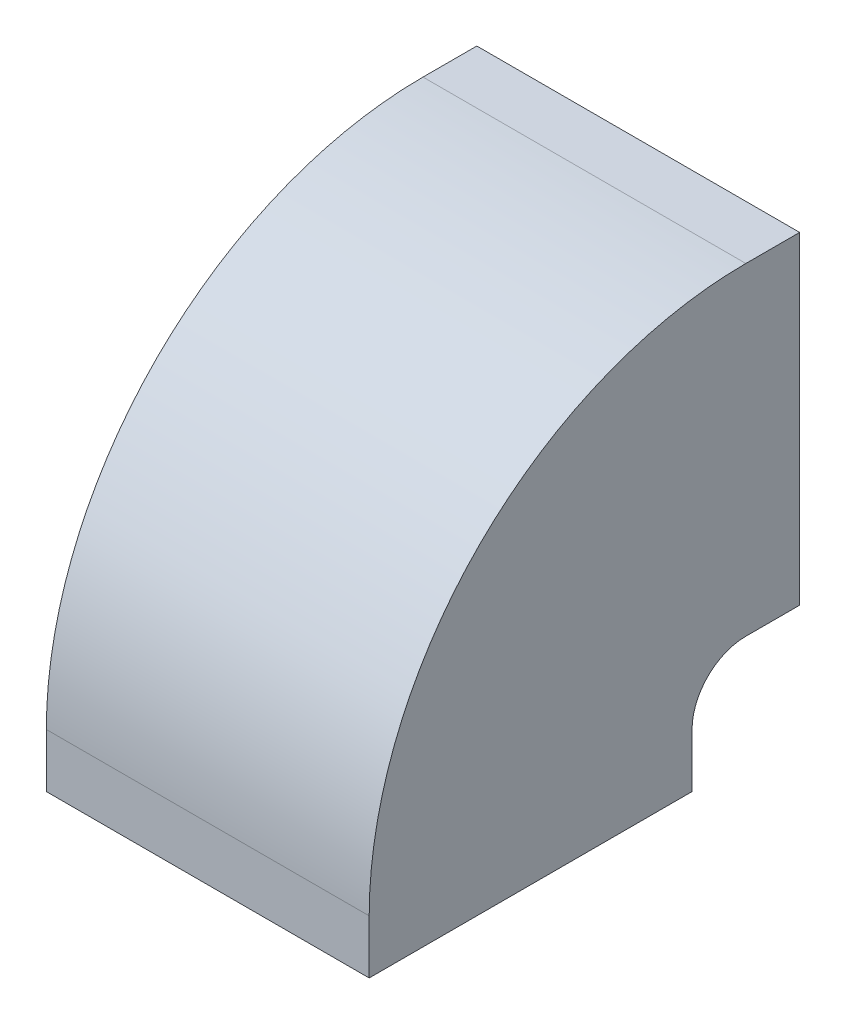
ISO-10303-21;
HEADER;
FILE_DESCRIPTION(('STEP AP214'),'2;1');
FILE_NAME('part.step','',(''),(''),'','','');
FILE_SCHEMA(('AUTOMOTIVE_DESIGN { 1 0 10303 214 1 1 1 1 }'));
ENDSEC;
DATA;
#1=APPLICATION_CONTEXT('core data for automotive mechanical design processes');
#2=APPLICATION_PROTOCOL_DEFINITION('international standard','automotive_design',2000,#1);
#3=PRODUCT_CONTEXT('',#1,'mechanical');
#4=PRODUCT('Part','Part','',(#3));
#5=PRODUCT_RELATED_PRODUCT_CATEGORY('part','',(#4));
#6=PRODUCT_DEFINITION_FORMATION('','',#4);
#7=PRODUCT_DEFINITION_CONTEXT('part definition',#1,'design');
#8=PRODUCT_DEFINITION('design','',#6,#7);
#9=PRODUCT_DEFINITION_SHAPE('','',#8);
#10=(LENGTH_UNIT() NAMED_UNIT(*) SI_UNIT(.MILLI.,.METRE.));
#11=(NAMED_UNIT(*) PLANE_ANGLE_UNIT() SI_UNIT($,.RADIAN.));
#12=(NAMED_UNIT(*) SI_UNIT($,.STERADIAN.) SOLID_ANGLE_UNIT());
#13=UNCERTAINTY_MEASURE_WITH_UNIT(LENGTH_MEASURE(1.E-05),#10,'distance_accuracy_value','');
#14=(GEOMETRIC_REPRESENTATION_CONTEXT(3) GLOBAL_UNCERTAINTY_ASSIGNED_CONTEXT((#13)) GLOBAL_UNIT_ASSIGNED_CONTEXT((#10,
#11,#12)) REPRESENTATION_CONTEXT('',''));
#15=CARTESIAN_POINT('',(0.,0.,0.));
#16=DIRECTION('',(0.,0.,1.));
#17=DIRECTION('',(1.,0.,0.));
#18=AXIS2_PLACEMENT_3D('',#15,#16,#17);
#19=CARTESIAN_POINT('',(152.4,203.2,-203.2));
#20=DIRECTION('',(0.,0.,1.));
#21=DIRECTION('',(1.,0.,0.));
#22=AXIS2_PLACEMENT_3D('',#19,#20,#21);
#23=PLANE('',#22);
#24=DIRECTION('',(0.,1.,0.));
#25=VECTOR('',#24,1.);
#26=CARTESIAN_POINT('',(0.,203.2,-203.2));
#27=LINE('',#26,#25);
#28=CARTESIAN_POINT('',(0.,50.8,-203.2));
#29=VERTEX_POINT('',#28);
#30=CARTESIAN_POINT('',(0.,203.2,-203.2));
#31=VERTEX_POINT('',#30);
#32=EDGE_CURVE('E206',#29,#31,#27,.T.);
#33=ORIENTED_EDGE('',*,*,#32,.T.);
#34=DIRECTION('',(-1.,0.,0.));
#35=VECTOR('',#34,1.);
#36=CARTESIAN_POINT('',(152.4,203.2,-203.2));
#37=LINE('',#36,#35);
#38=CARTESIAN_POINT('',(152.4,203.2,-203.2));
#39=VERTEX_POINT('',#38);
#40=EDGE_CURVE('E191',#39,#31,#37,.T.);
#41=ORIENTED_EDGE('',*,*,#40,.F.);
#42=DIRECTION('',(0.,1.,0.));
#43=VECTOR('',#42,1.);
#44=CARTESIAN_POINT('',(152.4,203.2,-203.2));
#45=LINE('',#44,#43);
#46=CARTESIAN_POINT('',(152.4,50.8,-203.2));
#47=VERTEX_POINT('',#46);
#48=EDGE_CURVE('E222',#47,#39,#45,.T.);
#49=ORIENTED_EDGE('',*,*,#48,.F.);
#50=DIRECTION('',(-1.,0.,0.));
#51=VECTOR('',#50,1.);
#52=CARTESIAN_POINT('',(152.4,50.8,-203.2));
#53=LINE('',#52,#51);
#54=EDGE_CURVE('E188',#47,#29,#53,.T.);
#55=ORIENTED_EDGE('',*,*,#54,.T.);
#56=EDGE_LOOP('',(#33,#41,#49,#55));
#57=FACE_BOUND('',#56,.T.);
#58=DIRECTION('',(0.,1.,0.));
#59=VECTOR('',#58,1.);
#60=CARTESIAN_POINT('',(2.54,25.4,-203.2));
#61=LINE('',#60,#59);
#62=CARTESIAN_POINT('',(2.54,53.34,-203.2));
#63=VERTEX_POINT('',#62);
#64=CARTESIAN_POINT('',(2.54,200.66,-203.2));
#65=VERTEX_POINT('',#64);
#66=EDGE_CURVE('E242',#63,#65,#61,.T.);
#67=ORIENTED_EDGE('',*,*,#66,.F.);
#68=DIRECTION('',(-1.,0.,0.));
#69=VECTOR('',#68,1.);
#70=CARTESIAN_POINT('',(152.4,53.34,-203.2));
#71=LINE('',#70,#69);
#72=CARTESIAN_POINT('',(149.86,53.34,-203.2));
#73=VERTEX_POINT('',#72);
#74=EDGE_CURVE('E240',#73,#63,#71,.T.);
#75=ORIENTED_EDGE('',*,*,#74,.F.);
#76=DIRECTION('',(0.,1.,0.));
#77=VECTOR('',#76,1.);
#78=CARTESIAN_POINT('',(149.86,25.4,-203.2));
#79=LINE('',#78,#77);
#80=CARTESIAN_POINT('',(149.86,200.66,-203.2));
#81=VERTEX_POINT('',#80);
#82=EDGE_CURVE('E62',#73,#81,#79,.T.);
#83=ORIENTED_EDGE('',*,*,#82,.T.);
#84=DIRECTION('',(-1.,0.,0.));
#85=VECTOR('',#84,1.);
#86=CARTESIAN_POINT('',(152.4,200.66,-203.2));
#87=LINE('',#86,#85);
#88=EDGE_CURVE('E237',#81,#65,#87,.T.);
#89=ORIENTED_EDGE('',*,*,#88,.T.);
#90=EDGE_LOOP('',(#67,#75,#83,#89));
#91=FACE_BOUND('',#90,.T.);
#92=ADVANCED_FACE('F39',(#57,#91),#23,.F.);
#93=CARTESIAN_POINT('',(152.4,0.,0.));
#94=DIRECTION('',(0.,0.,-1.));
#95=DIRECTION('',(-1.,0.,0.));
#96=AXIS2_PLACEMENT_3D('',#93,#94,#95);
#97=PLANE('',#96);
#98=DIRECTION('',(0.,-1.,0.));
#99=VECTOR('',#98,1.);
#100=CARTESIAN_POINT('',(0.,0.,0.));
#101=LINE('',#100,#99);
#102=CARTESIAN_POINT('',(0.,25.4,0.));
#103=VERTEX_POINT('',#102);
#104=CARTESIAN_POINT('',(0.,0.,0.));
#105=VERTEX_POINT('',#104);
#106=EDGE_CURVE('E216',#103,#105,#101,.T.);
#107=ORIENTED_EDGE('',*,*,#106,.T.);
#108=DIRECTION('',(-1.,0.,0.));
#109=VECTOR('',#108,1.);
#110=CARTESIAN_POINT('',(152.4,0.,0.));
#111=LINE('',#110,#109);
#112=CARTESIAN_POINT('',(152.4,0.,0.));
#113=VERTEX_POINT('',#112);
#114=EDGE_CURVE('E169',#113,#105,#111,.T.);
#115=ORIENTED_EDGE('',*,*,#114,.F.);
#116=DIRECTION('',(0.,-1.,0.));
#117=VECTOR('',#116,1.);
#118=CARTESIAN_POINT('',(152.4,0.,0.));
#119=LINE('',#118,#117);
#120=CARTESIAN_POINT('',(152.4,25.4,0.));
#121=VERTEX_POINT('',#120);
#122=EDGE_CURVE('E203',#121,#113,#119,.T.);
#123=ORIENTED_EDGE('',*,*,#122,.F.);
#124=DIRECTION('',(-1.,0.,0.));
#125=VECTOR('',#124,1.);
#126=CARTESIAN_POINT('',(152.4,25.4,0.));
#127=LINE('',#126,#125);
#128=EDGE_CURVE('E197',#121,#103,#127,.T.);
#129=ORIENTED_EDGE('',*,*,#128,.T.);
#130=EDGE_LOOP('',(#107,#115,#123,#129));
#131=FACE_BOUND('',#130,.T.);
#132=ADVANCED_FACE('F41',(#131),#97,.F.);
#133=CARTESIAN_POINT('',(152.4,0.,0.));
#134=DIRECTION('',(0.,1.,0.));
#135=DIRECTION('',(0.,0.,1.));
#136=AXIS2_PLACEMENT_3D('',#133,#134,#135);
#137=PLANE('',#136);
#138=DIRECTION('',(0.,0.,-1.));
#139=VECTOR('',#138,1.);
#140=CARTESIAN_POINT('',(149.86,0.,0.));
#141=LINE('',#140,#139);
#142=CARTESIAN_POINT('',(149.86,0.,-2.54));
#143=VERTEX_POINT('',#142);
#144=CARTESIAN_POINT('',(149.86,0.,-149.86));
#145=VERTEX_POINT('',#144);
#146=EDGE_CURVE('E47',#143,#145,#141,.T.);
#147=ORIENTED_EDGE('',*,*,#146,.T.);
#148=DIRECTION('',(-1.,0.,0.));
#149=VECTOR('',#148,1.);
#150=CARTESIAN_POINT('',(152.4,0.,-149.86));
#151=LINE('',#150,#149);
#152=CARTESIAN_POINT('',(2.54,0.,-149.86));
#153=VERTEX_POINT('',#152);
#154=EDGE_CURVE('E11',#145,#153,#151,.T.);
#155=ORIENTED_EDGE('',*,*,#154,.T.);
#156=DIRECTION('',(0.,0.,1.));
#157=VECTOR('',#156,1.);
#158=CARTESIAN_POINT('',(2.53999999999999,0.,0.));
#159=LINE('',#158,#157);
#160=CARTESIAN_POINT('',(2.53999999999999,0.,-2.54));
#161=VERTEX_POINT('',#160);
#162=EDGE_CURVE('E164',#153,#161,#159,.T.);
#163=ORIENTED_EDGE('',*,*,#162,.T.);
#164=DIRECTION('',(1.,0.,0.));
#165=VECTOR('',#164,1.);
#166=CARTESIAN_POINT('',(152.4,0.,-2.54));
#167=LINE('',#166,#165);
#168=EDGE_CURVE('E168',#161,#143,#167,.T.);
#169=ORIENTED_EDGE('',*,*,#168,.T.);
#170=EDGE_LOOP('',(#147,#155,#163,#169));
#171=FACE_BOUND('',#170,.T.);
#172=DIRECTION('',(0.,0.,-1.));
#173=VECTOR('',#172,1.);
#174=CARTESIAN_POINT('',(0.,0.,0.));
#175=LINE('',#174,#173);
#176=CARTESIAN_POINT('',(0.,0.,-152.4));
#177=VERTEX_POINT('',#176);
#178=EDGE_CURVE('E214',#105,#177,#175,.T.);
#179=ORIENTED_EDGE('',*,*,#178,.T.);
#180=DIRECTION('',(-1.,0.,0.));
#181=VECTOR('',#180,1.);
#182=CARTESIAN_POINT('',(152.4,0.,-152.4));
#183=LINE('',#182,#181);
#184=CARTESIAN_POINT('',(152.4,0.,-152.4));
#185=VERTEX_POINT('',#184);
#186=EDGE_CURVE('E179',#185,#177,#183,.T.);
#187=ORIENTED_EDGE('',*,*,#186,.F.);
#188=DIRECTION('',(0.,0.,-1.));
#189=VECTOR('',#188,1.);
#190=CARTESIAN_POINT('',(152.4,0.,0.));
#191=LINE('',#190,#189);
#192=EDGE_CURVE('E230',#113,#185,#191,.T.);
#193=ORIENTED_EDGE('',*,*,#192,.F.);
#194=ORIENTED_EDGE('',*,*,#114,.T.);
#195=EDGE_LOOP('',(#179,#187,#193,#194));
#196=FACE_BOUND('',#195,.T.);
#197=ADVANCED_FACE('F171',(#171,#196),#137,.F.);
#198=CARTESIAN_POINT('',(152.4,0.,-152.4));
#199=DIRECTION('',(0.,0.,1.));
#200=DIRECTION('',(1.,0.,0.));
#201=AXIS2_PLACEMENT_3D('',#198,#199,#200);
#202=PLANE('',#201);
#203=DIRECTION('',(0.,1.,0.));
#204=VECTOR('',#203,1.);
#205=CARTESIAN_POINT('',(0.,0.,-152.4));
#206=LINE('',#205,#204);
#207=CARTESIAN_POINT('',(0.,25.4,-152.4));
#208=VERTEX_POINT('',#207);
#209=EDGE_CURVE('E212',#177,#208,#206,.T.);
#210=ORIENTED_EDGE('',*,*,#209,.T.);
#211=DIRECTION('',(-1.,0.,0.));
#212=VECTOR('',#211,1.);
#213=CARTESIAN_POINT('',(152.4,25.4,-152.4));
#214=LINE('',#213,#212);
#215=CARTESIAN_POINT('',(152.4,25.4,-152.4));
#216=VERTEX_POINT('',#215);
#217=EDGE_CURVE('E182',#216,#208,#214,.T.);
#218=ORIENTED_EDGE('',*,*,#217,.F.);
#219=DIRECTION('',(0.,1.,0.));
#220=VECTOR('',#219,1.);
#221=CARTESIAN_POINT('',(152.4,0.,-152.4));
#222=LINE('',#221,#220);
#223=EDGE_CURVE('E228',#185,#216,#222,.T.);
#224=ORIENTED_EDGE('',*,*,#223,.F.);
#225=ORIENTED_EDGE('',*,*,#186,.T.);
#226=EDGE_LOOP('',(#210,#218,#224,#225));
#227=FACE_BOUND('',#226,.T.);
#228=ADVANCED_FACE('F320',(#227),#202,.F.);
#229=CARTESIAN_POINT('',(152.4,25.4,-177.8));
#230=DIRECTION('',(-1.,0.,0.));
#231=DIRECTION('',(0.,0.,1.));
#232=AXIS2_PLACEMENT_3D('',#229,#230,#231);
#233=CYLINDRICAL_SURFACE('',#232,25.4);
#234=CARTESIAN_POINT('',(0.,25.4,-177.8));
#235=DIRECTION('',(-1.,0.,0.));
#236=DIRECTION('',(0.,0.,-1.));
#237=AXIS2_PLACEMENT_3D('',#234,#235,#236);
#238=CIRCLE('',#237,25.4);
#239=CARTESIAN_POINT('',(0.,50.8,-177.8));
#240=VERTEX_POINT('',#239);
#241=EDGE_CURVE('E210',#208,#240,#238,.T.);
#242=ORIENTED_EDGE('',*,*,#241,.T.);
#243=DIRECTION('',(-1.,0.,0.));
#244=VECTOR('',#243,1.);
#245=CARTESIAN_POINT('',(152.4,50.8,-177.8));
#246=LINE('',#245,#244);
#247=CARTESIAN_POINT('',(152.4,50.8,-177.8));
#248=VERTEX_POINT('',#247);
#249=EDGE_CURVE('E185',#248,#240,#246,.T.);
#250=ORIENTED_EDGE('',*,*,#249,.F.);
#251=CARTESIAN_POINT('',(152.4,25.4,-177.8));
#252=DIRECTION('',(-1.,0.,0.));
#253=DIRECTION('',(0.,0.,-1.));
#254=AXIS2_PLACEMENT_3D('',#251,#252,#253);
#255=CIRCLE('',#254,25.4);
#256=EDGE_CURVE('E226',#216,#248,#255,.T.);
#257=ORIENTED_EDGE('',*,*,#256,.F.);
#258=ORIENTED_EDGE('',*,*,#217,.T.);
#259=EDGE_LOOP('',(#242,#250,#257,#258));
#260=FACE_BOUND('',#259,.T.);
#261=ADVANCED_FACE('F316',(#260),#233,.F.);
#262=CARTESIAN_POINT('',(152.4,50.8,-203.2));
#263=DIRECTION('',(0.,1.,0.));
#264=DIRECTION('',(0.,0.,1.));
#265=AXIS2_PLACEMENT_3D('',#262,#263,#264);
#266=PLANE('',#265);
#267=DIRECTION('',(0.,0.,-1.));
#268=VECTOR('',#267,1.);
#269=CARTESIAN_POINT('',(0.,50.8,-203.2));
#270=LINE('',#269,#268);
#271=EDGE_CURVE('E208',#240,#29,#270,.T.);
#272=ORIENTED_EDGE('',*,*,#271,.T.);
#273=ORIENTED_EDGE('',*,*,#54,.F.);
#274=DIRECTION('',(0.,0.,-1.));
#275=VECTOR('',#274,1.);
#276=CARTESIAN_POINT('',(152.4,50.8,-203.2));
#277=LINE('',#276,#275);
#278=EDGE_CURVE('E224',#248,#47,#277,.T.);
#279=ORIENTED_EDGE('',*,*,#278,.F.);
#280=ORIENTED_EDGE('',*,*,#249,.T.);
#281=EDGE_LOOP('',(#272,#273,#279,#280));
#282=FACE_BOUND('',#281,.T.);
#283=ADVANCED_FACE('F313',(#282),#266,.F.);
#284=CARTESIAN_POINT('',(152.4,203.2,-177.8));
#285=DIRECTION('',(0.,-1.,0.));
#286=DIRECTION('',(0.,0.,-1.));
#287=AXIS2_PLACEMENT_3D('',#284,#285,#286);
#288=PLANE('',#287);
#289=DIRECTION('',(0.,0.,1.));
#290=VECTOR('',#289,1.);
#291=CARTESIAN_POINT('',(0.,203.2,-177.8));
#292=LINE('',#291,#290);
#293=CARTESIAN_POINT('',(0.,203.2,-177.8));
#294=VERTEX_POINT('',#293);
#295=EDGE_CURVE('E204',#31,#294,#292,.T.);
#296=ORIENTED_EDGE('',*,*,#295,.T.);
#297=DIRECTION('',(-1.,0.,0.));
#298=VECTOR('',#297,1.);
#299=CARTESIAN_POINT('',(152.4,203.2,-177.8));
#300=LINE('',#299,#298);
#301=CARTESIAN_POINT('',(152.4,203.2,-177.8));
#302=VERTEX_POINT('',#301);
#303=EDGE_CURVE('E194',#302,#294,#300,.T.);
#304=ORIENTED_EDGE('',*,*,#303,.F.);
#305=DIRECTION('',(0.,0.,1.));
#306=VECTOR('',#305,1.);
#307=CARTESIAN_POINT('',(152.4,203.2,-177.8));
#308=LINE('',#307,#306);
#309=EDGE_CURVE('E220',#39,#302,#308,.T.);
#310=ORIENTED_EDGE('',*,*,#309,.F.);
#311=ORIENTED_EDGE('',*,*,#40,.T.);
#312=EDGE_LOOP('',(#296,#304,#310,#311));
#313=FACE_BOUND('',#312,.T.);
#314=ADVANCED_FACE('F311',(#313),#288,.F.);
#315=CARTESIAN_POINT('',(152.4,25.4,-177.8));
#316=DIRECTION('',(-1.,0.,0.));
#317=DIRECTION('',(0.,0.,1.));
#318=AXIS2_PLACEMENT_3D('',#315,#316,#317);
#319=CYLINDRICAL_SURFACE('',#318,177.8);
#320=CARTESIAN_POINT('',(0.,25.4,-177.8));
#321=DIRECTION('',(1.,0.,0.));
#322=DIRECTION('',(0.,0.,1.));
#323=AXIS2_PLACEMENT_3D('',#320,#321,#322);
#324=CIRCLE('',#323,177.8);
#325=EDGE_CURVE('E201',#294,#103,#324,.T.);
#326=ORIENTED_EDGE('',*,*,#325,.T.);
#327=ORIENTED_EDGE('',*,*,#128,.F.);
#328=CARTESIAN_POINT('',(152.4,25.4,-177.8));
#329=DIRECTION('',(1.,0.,0.));
#330=DIRECTION('',(0.,0.,1.));
#331=AXIS2_PLACEMENT_3D('',#328,#329,#330);
#332=CIRCLE('',#331,177.8);
#333=EDGE_CURVE('E200',#302,#121,#332,.T.);
#334=ORIENTED_EDGE('',*,*,#333,.F.);
#335=ORIENTED_EDGE('',*,*,#303,.T.);
#336=EDGE_LOOP('',(#326,#327,#334,#335));
#337=FACE_BOUND('',#336,.T.);
#338=ADVANCED_FACE('F349',(#337),#319,.T.);
#339=CARTESIAN_POINT('',(152.4,25.4,-177.8));
#340=DIRECTION('',(-1.,0.,0.));
#341=DIRECTION('',(0.,0.,1.));
#342=AXIS2_PLACEMENT_3D('',#339,#340,#341);
#343=PLANE('',#342);
#344=ORIENTED_EDGE('',*,*,#122,.T.);
#345=ORIENTED_EDGE('',*,*,#192,.T.);
#346=ORIENTED_EDGE('',*,*,#223,.T.);
#347=ORIENTED_EDGE('',*,*,#256,.T.);
#348=ORIENTED_EDGE('',*,*,#278,.T.);
#349=ORIENTED_EDGE('',*,*,#48,.T.);
#350=ORIENTED_EDGE('',*,*,#309,.T.);
#351=ORIENTED_EDGE('',*,*,#333,.T.);
#352=EDGE_LOOP('',(#344,#345,#346,#347,#348,#349,#350,#351));
#353=FACE_BOUND('',#352,.T.);
#354=ADVANCED_FACE('F356',(#353),#343,.F.);
#355=CARTESIAN_POINT('',(0.,25.4,-177.8));
#356=DIRECTION('',(-1.,0.,0.));
#357=DIRECTION('',(0.,0.,1.));
#358=AXIS2_PLACEMENT_3D('',#355,#356,#357);
#359=PLANE('',#358);
#360=ORIENTED_EDGE('',*,*,#106,.F.);
#361=ORIENTED_EDGE('',*,*,#325,.F.);
#362=ORIENTED_EDGE('',*,*,#295,.F.);
#363=ORIENTED_EDGE('',*,*,#32,.F.);
#364=ORIENTED_EDGE('',*,*,#271,.F.);
#365=ORIENTED_EDGE('',*,*,#241,.F.);
#366=ORIENTED_EDGE('',*,*,#209,.F.);
#367=ORIENTED_EDGE('',*,*,#178,.F.);
#368=EDGE_LOOP('',(#360,#361,#362,#363,#364,#365,#366,#367));
#369=FACE_BOUND('',#368,.T.);
#370=ADVANCED_FACE('F363',(#369),#359,.T.);
#371=CARTESIAN_POINT('',(152.4,0.,-2.54));
#372=DIRECTION('',(0.,0.,-1.));
#373=DIRECTION('',(-1.,0.,0.));
#374=AXIS2_PLACEMENT_3D('',#371,#372,#373);
#375=PLANE('',#374);
#376=DIRECTION('',(0.,-1.,0.));
#377=VECTOR('',#376,1.);
#378=CARTESIAN_POINT('',(2.54,25.4,-2.53999999999999));
#379=LINE('',#378,#377);
#380=CARTESIAN_POINT('',(2.53999999999999,25.4,-2.54));
#381=VERTEX_POINT('',#380);
#382=EDGE_CURVE('E54',#381,#161,#379,.T.);
#383=ORIENTED_EDGE('',*,*,#382,.F.);
#384=DIRECTION('',(-1.,0.,0.));
#385=VECTOR('',#384,1.);
#386=CARTESIAN_POINT('',(152.4,25.4,-2.54));
#387=LINE('',#386,#385);
#388=CARTESIAN_POINT('',(149.86,25.4,-2.54));
#389=VERTEX_POINT('',#388);
#390=EDGE_CURVE('E254',#389,#381,#387,.T.);
#391=ORIENTED_EDGE('',*,*,#390,.F.);
#392=DIRECTION('',(0.,-1.,0.));
#393=VECTOR('',#392,1.);
#394=CARTESIAN_POINT('',(149.86,25.4,-2.53999999999999));
#395=LINE('',#394,#393);
#396=EDGE_CURVE('E251',#389,#143,#395,.T.);
#397=ORIENTED_EDGE('',*,*,#396,.T.);
#398=ORIENTED_EDGE('',*,*,#168,.F.);
#399=EDGE_LOOP('',(#383,#391,#397,#398));
#400=FACE_BOUND('',#399,.T.);
#401=ADVANCED_FACE('F274',(#400),#375,.T.);
#402=CARTESIAN_POINT('',(152.4,0.,-149.86));
#403=DIRECTION('',(0.,0.,1.));
#404=DIRECTION('',(1.,0.,0.));
#405=AXIS2_PLACEMENT_3D('',#402,#403,#404);
#406=PLANE('',#405);
#407=DIRECTION('',(0.,1.,0.));
#408=VECTOR('',#407,1.);
#409=CARTESIAN_POINT('',(2.54,25.4,-149.86));
#410=LINE('',#409,#408);
#411=CARTESIAN_POINT('',(2.53999999999999,25.4,-149.86));
#412=VERTEX_POINT('',#411);
#413=EDGE_CURVE('E155',#153,#412,#410,.T.);
#414=ORIENTED_EDGE('',*,*,#413,.F.);
#415=ORIENTED_EDGE('',*,*,#154,.F.);
#416=DIRECTION('',(0.,1.,0.));
#417=VECTOR('',#416,1.);
#418=CARTESIAN_POINT('',(149.86,25.4,-149.86));
#419=LINE('',#418,#417);
#420=CARTESIAN_POINT('',(149.86,25.4,-149.86));
#421=VERTEX_POINT('',#420);
#422=EDGE_CURVE('E263',#145,#421,#419,.T.);
#423=ORIENTED_EDGE('',*,*,#422,.T.);
#424=DIRECTION('',(-1.,0.,0.));
#425=VECTOR('',#424,1.);
#426=CARTESIAN_POINT('',(152.4,25.4,-149.86));
#427=LINE('',#426,#425);
#428=EDGE_CURVE('E159',#421,#412,#427,.T.);
#429=ORIENTED_EDGE('',*,*,#428,.T.);
#430=EDGE_LOOP('',(#414,#415,#423,#429));
#431=FACE_BOUND('',#430,.T.);
#432=ADVANCED_FACE('F156',(#431),#406,.T.);
#433=CARTESIAN_POINT('',(152.4,25.4,-177.8));
#434=DIRECTION('',(-1.,0.,0.));
#435=DIRECTION('',(0.,0.,1.));
#436=AXIS2_PLACEMENT_3D('',#433,#434,#435);
#437=CYLINDRICAL_SURFACE('',#436,27.94);
#438=CARTESIAN_POINT('',(2.53999999999999,25.4,-177.8));
#439=DIRECTION('',(-1.,0.,0.));
#440=DIRECTION('',(0.,0.,1.));
#441=AXIS2_PLACEMENT_3D('',#438,#439,#440);
#442=CIRCLE('',#441,27.94);
#443=CARTESIAN_POINT('',(2.53999999999999,53.34,-177.8));
#444=VERTEX_POINT('',#443);
#445=EDGE_CURVE('E161',#412,#444,#442,.T.);
#446=ORIENTED_EDGE('',*,*,#445,.F.);
#447=ORIENTED_EDGE('',*,*,#428,.F.);
#448=CARTESIAN_POINT('',(149.86,25.4,-177.8));
#449=DIRECTION('',(-1.,0.,0.));
#450=DIRECTION('',(0.,0.,1.));
#451=AXIS2_PLACEMENT_3D('',#448,#449,#450);
#452=CIRCLE('',#451,27.94);
#453=CARTESIAN_POINT('',(149.86,53.34,-177.8));
#454=VERTEX_POINT('',#453);
#455=EDGE_CURVE('E260',#421,#454,#452,.T.);
#456=ORIENTED_EDGE('',*,*,#455,.T.);
#457=DIRECTION('',(1.,0.,0.));
#458=VECTOR('',#457,1.);
#459=CARTESIAN_POINT('',(152.4,53.34,-177.8));
#460=LINE('',#459,#458);
#461=EDGE_CURVE('E248',#454,#444,#460,.F.);
#462=ORIENTED_EDGE('',*,*,#461,.T.);
#463=EDGE_LOOP('',(#446,#447,#456,#462));
#464=FACE_BOUND('',#463,.T.);
#465=ADVANCED_FACE('F293',(#464),#437,.T.);
#466=CARTESIAN_POINT('',(152.4,53.34,-203.2));
#467=DIRECTION('',(0.,1.,0.));
#468=DIRECTION('',(0.,0.,1.));
#469=AXIS2_PLACEMENT_3D('',#466,#467,#468);
#470=PLANE('',#469);
#471=DIRECTION('',(0.,0.,-1.));
#472=VECTOR('',#471,1.);
#473=CARTESIAN_POINT('',(2.54,53.34,-177.8));
#474=LINE('',#473,#472);
#475=EDGE_CURVE('E245',#444,#63,#474,.T.);
#476=ORIENTED_EDGE('',*,*,#475,.F.);
#477=ORIENTED_EDGE('',*,*,#461,.F.);
#478=DIRECTION('',(0.,0.,-1.));
#479=VECTOR('',#478,1.);
#480=CARTESIAN_POINT('',(149.86,53.34,-177.8));
#481=LINE('',#480,#479);
#482=EDGE_CURVE('E236',#454,#73,#481,.T.);
#483=ORIENTED_EDGE('',*,*,#482,.T.);
#484=ORIENTED_EDGE('',*,*,#74,.T.);
#485=EDGE_LOOP('',(#476,#477,#483,#484));
#486=FACE_BOUND('',#485,.T.);
#487=ADVANCED_FACE('F289',(#486),#470,.T.);
#488=CARTESIAN_POINT('',(152.4,200.66,-177.8));
#489=DIRECTION('',(0.,-1.,0.));
#490=DIRECTION('',(0.,0.,-1.));
#491=AXIS2_PLACEMENT_3D('',#488,#489,#490);
#492=PLANE('',#491);
#493=DIRECTION('',(0.,0.,1.));
#494=VECTOR('',#493,1.);
#495=CARTESIAN_POINT('',(2.54,200.66,-177.8));
#496=LINE('',#495,#494);
#497=CARTESIAN_POINT('',(2.53999999999999,200.66,-177.8));
#498=VERTEX_POINT('',#497);
#499=EDGE_CURVE('E244',#65,#498,#496,.T.);
#500=ORIENTED_EDGE('',*,*,#499,.F.);
#501=ORIENTED_EDGE('',*,*,#88,.F.);
#502=DIRECTION('',(0.,0.,1.));
#503=VECTOR('',#502,1.);
#504=CARTESIAN_POINT('',(149.86,200.66,-177.8));
#505=LINE('',#504,#503);
#506=CARTESIAN_POINT('',(149.86,200.66,-177.8));
#507=VERTEX_POINT('',#506);
#508=EDGE_CURVE('E235',#81,#507,#505,.T.);
#509=ORIENTED_EDGE('',*,*,#508,.T.);
#510=DIRECTION('',(-1.,0.,0.));
#511=VECTOR('',#510,1.);
#512=CARTESIAN_POINT('',(152.4,200.66,-177.8));
#513=LINE('',#512,#511);
#514=EDGE_CURVE('E241',#507,#498,#513,.T.);
#515=ORIENTED_EDGE('',*,*,#514,.T.);
#516=EDGE_LOOP('',(#500,#501,#509,#515));
#517=FACE_BOUND('',#516,.T.);
#518=ADVANCED_FACE('F283',(#517),#492,.T.);
#519=CARTESIAN_POINT('',(152.4,25.4,-177.8));
#520=DIRECTION('',(-1.,0.,0.));
#521=DIRECTION('',(0.,0.,1.));
#522=AXIS2_PLACEMENT_3D('',#519,#520,#521);
#523=CYLINDRICAL_SURFACE('',#522,175.26);
#524=CARTESIAN_POINT('',(2.53999999999999,25.4,-177.8));
#525=DIRECTION('',(-1.,0.,0.));
#526=DIRECTION('',(0.,0.,1.));
#527=AXIS2_PLACEMENT_3D('',#524,#525,#526);
#528=CIRCLE('',#527,175.26);
#529=EDGE_CURVE('E249',#498,#381,#528,.F.);
#530=ORIENTED_EDGE('',*,*,#529,.F.);
#531=ORIENTED_EDGE('',*,*,#514,.F.);
#532=CARTESIAN_POINT('',(149.86,25.4,-177.8));
#533=DIRECTION('',(-1.,0.,0.));
#534=DIRECTION('',(0.,0.,1.));
#535=AXIS2_PLACEMENT_3D('',#532,#533,#534);
#536=CIRCLE('',#535,175.26);
#537=EDGE_CURVE('E256',#507,#389,#536,.F.);
#538=ORIENTED_EDGE('',*,*,#537,.T.);
#539=ORIENTED_EDGE('',*,*,#390,.T.);
#540=EDGE_LOOP('',(#530,#531,#538,#539));
#541=FACE_BOUND('',#540,.T.);
#542=ADVANCED_FACE('F280',(#541),#523,.F.);
#543=CARTESIAN_POINT('',(149.86,25.4,-177.8));
#544=DIRECTION('',(-1.,0.,0.));
#545=DIRECTION('',(0.,0.,1.));
#546=AXIS2_PLACEMENT_3D('',#543,#544,#545);
#547=PLANE('',#546);
#548=ORIENTED_EDGE('',*,*,#396,.F.);
#549=ORIENTED_EDGE('',*,*,#537,.F.);
#550=ORIENTED_EDGE('',*,*,#508,.F.);
#551=ORIENTED_EDGE('',*,*,#82,.F.);
#552=ORIENTED_EDGE('',*,*,#482,.F.);
#553=ORIENTED_EDGE('',*,*,#455,.F.);
#554=ORIENTED_EDGE('',*,*,#422,.F.);
#555=ORIENTED_EDGE('',*,*,#146,.F.);
#556=EDGE_LOOP('',(#548,#549,#550,#551,#552,#553,#554,#555));
#557=FACE_BOUND('',#556,.T.);
#558=ADVANCED_FACE('F276',(#557),#547,.T.);
#559=CARTESIAN_POINT('',(2.54,25.4,-177.8));
#560=DIRECTION('',(-1.,0.,0.));
#561=DIRECTION('',(0.,0.,1.));
#562=AXIS2_PLACEMENT_3D('',#559,#560,#561);
#563=PLANE('',#562);
#564=ORIENTED_EDGE('',*,*,#382,.T.);
#565=ORIENTED_EDGE('',*,*,#162,.F.);
#566=ORIENTED_EDGE('',*,*,#413,.T.);
#567=ORIENTED_EDGE('',*,*,#445,.T.);
#568=ORIENTED_EDGE('',*,*,#475,.T.);
#569=ORIENTED_EDGE('',*,*,#66,.T.);
#570=ORIENTED_EDGE('',*,*,#499,.T.);
#571=ORIENTED_EDGE('',*,*,#529,.T.);
#572=EDGE_LOOP('',(#564,#565,#566,#567,#568,#569,#570,#571));
#573=FACE_BOUND('',#572,.T.);
#574=ADVANCED_FACE('F165',(#573),#563,.F.);
#575=CLOSED_SHELL('',(#92,#132,#197,#228,#261,#283,#314,#338,#354,#370,#401,#432,#465,#487,#518,
#542,#558,#574));
#576=MANIFOLD_SOLID_BREP('B2',#575);
#577=ADVANCED_BREP_SHAPE_REPRESENTATION('',(#18,#576),#14);
#578=SHAPE_DEFINITION_REPRESENTATION(#9,#577);
ENDSEC;
END-ISO-10303-21;
